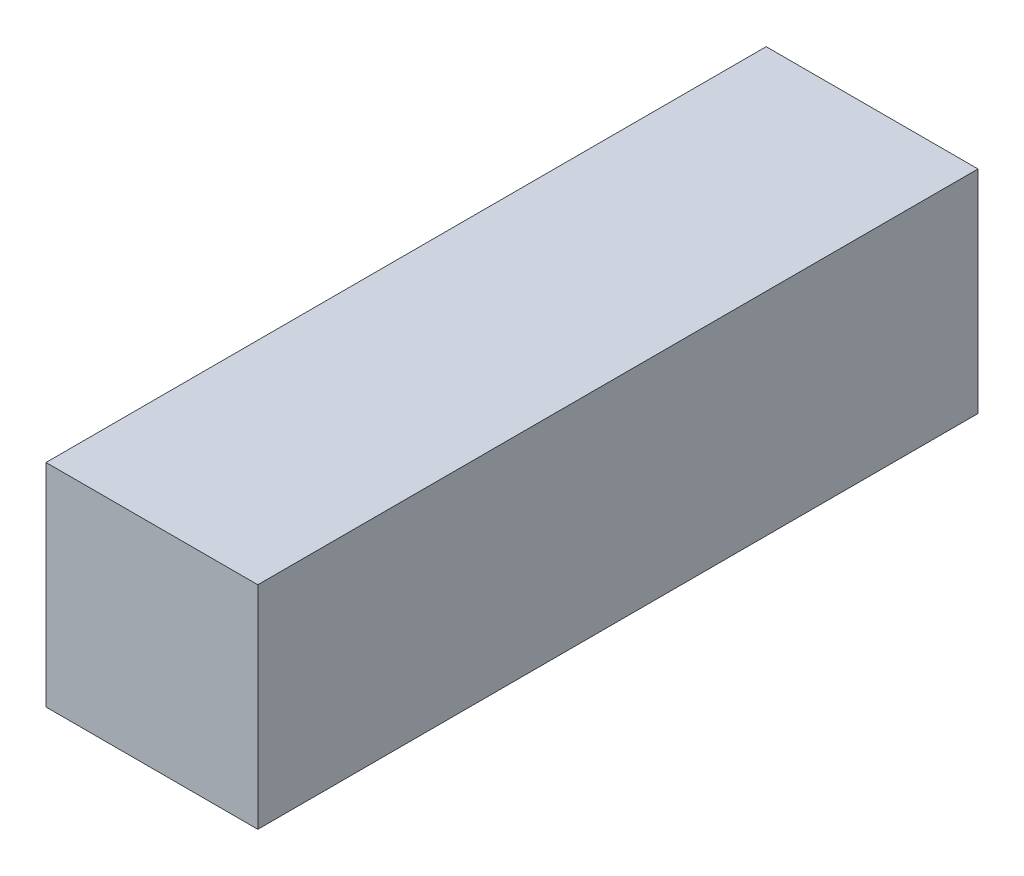
ISO-10303-21;
HEADER;
FILE_DESCRIPTION(('STEP AP214'),'2;1');
FILE_NAME('part.step','',(''),(''),'','','');
FILE_SCHEMA(('AUTOMOTIVE_DESIGN { 1 0 10303 214 1 1 1 1 }'));
ENDSEC;
DATA;
#1=APPLICATION_CONTEXT('core data for automotive mechanical design processes');
#2=APPLICATION_PROTOCOL_DEFINITION('international standard','automotive_design',2000,#1);
#3=PRODUCT_CONTEXT('',#1,'mechanical');
#4=PRODUCT('Part','Part','',(#3));
#5=PRODUCT_RELATED_PRODUCT_CATEGORY('part','',(#4));
#6=PRODUCT_DEFINITION_FORMATION('','',#4);
#7=PRODUCT_DEFINITION_CONTEXT('part definition',#1,'design');
#8=PRODUCT_DEFINITION('design','',#6,#7);
#9=PRODUCT_DEFINITION_SHAPE('','',#8);
#10=(LENGTH_UNIT() NAMED_UNIT(*) SI_UNIT(.MILLI.,.METRE.));
#11=(NAMED_UNIT(*) PLANE_ANGLE_UNIT() SI_UNIT($,.RADIAN.));
#12=(NAMED_UNIT(*) SI_UNIT($,.STERADIAN.) SOLID_ANGLE_UNIT());
#13=UNCERTAINTY_MEASURE_WITH_UNIT(LENGTH_MEASURE(1.E-05),#10,'distance_accuracy_value','');
#14=(GEOMETRIC_REPRESENTATION_CONTEXT(3) GLOBAL_UNCERTAINTY_ASSIGNED_CONTEXT((#13)) GLOBAL_UNIT_ASSIGNED_CONTEXT((#10,
#11,#12)) REPRESENTATION_CONTEXT('',''));
#15=CARTESIAN_POINT('',(0.,0.,0.));
#16=DIRECTION('',(0.,0.,1.));
#17=DIRECTION('',(1.,0.,0.));
#18=AXIS2_PLACEMENT_3D('',#15,#16,#17);
#19=CARTESIAN_POINT('',(0.,0.,0.));
#20=DIRECTION('',(0.,0.,1.));
#21=DIRECTION('',(1.,0.,0.));
#22=AXIS2_PLACEMENT_3D('',#19,#20,#21);
#23=PLANE('',#22);
#24=DIRECTION('',(0.,1.,0.));
#25=VECTOR('',#24,1.);
#26=CARTESIAN_POINT('',(-12.,12.,0.));
#27=LINE('',#26,#25);
#28=CARTESIAN_POINT('',(-12.,12.,0.));
#29=VERTEX_POINT('',#28);
#30=CARTESIAN_POINT('',(-12.,32.,0.));
#31=VERTEX_POINT('',#30);
#32=EDGE_CURVE('E83',#29,#31,#27,.T.);
#33=ORIENTED_EDGE('',*,*,#32,.F.);
#34=DIRECTION('',(1.,0.,0.));
#35=VECTOR('',#34,1.);
#36=CARTESIAN_POINT('',(-12.,12.,0.));
#37=LINE('',#36,#35);
#38=CARTESIAN_POINT('',(-32.,12.,0.));
#39=VERTEX_POINT('',#38);
#40=EDGE_CURVE('E94',#39,#29,#37,.T.);
#41=ORIENTED_EDGE('',*,*,#40,.F.);
#42=DIRECTION('',(0.,-1.,0.));
#43=VECTOR('',#42,1.);
#44=CARTESIAN_POINT('',(-32.,12.,0.));
#45=LINE('',#44,#43);
#46=CARTESIAN_POINT('',(-32.,32.,0.));
#47=VERTEX_POINT('',#46);
#48=EDGE_CURVE('E85',#47,#39,#45,.T.);
#49=ORIENTED_EDGE('',*,*,#48,.F.);
#50=DIRECTION('',(-1.,0.,0.));
#51=VECTOR('',#50,1.);
#52=CARTESIAN_POINT('',(-12.,32.,0.));
#53=LINE('',#52,#51);
#54=EDGE_CURVE('E75',#31,#47,#53,.T.);
#55=ORIENTED_EDGE('',*,*,#54,.F.);
#56=EDGE_LOOP('',(#33,#41,#49,#55));
#57=FACE_BOUND('',#56,.T.);
#58=ADVANCED_FACE('F33',(#57),#23,.F.);
#59=CARTESIAN_POINT('',(-12.,12.,96.2842712474639));
#60=DIRECTION('',(0.,1.,0.));
#61=DIRECTION('',(-1.,0.,0.));
#62=AXIS2_PLACEMENT_3D('',#59,#60,#61);
#63=PLANE('',#62);
#64=DIRECTION('',(0.,0.,-1.));
#65=VECTOR('',#64,1.);
#66=CARTESIAN_POINT('',(-12.,12.,96.2842712474639));
#67=LINE('',#66,#65);
#68=CARTESIAN_POINT('',(-12.,12.,68.000000000002));
#69=VERTEX_POINT('',#68);
#70=EDGE_CURVE('E88',#69,#29,#67,.T.);
#71=ORIENTED_EDGE('',*,*,#70,.F.);
#72=DIRECTION('',(-1.,0.,0.));
#73=VECTOR('',#72,1.);
#74=CARTESIAN_POINT('',(-12.,12.,68.000000000002));
#75=LINE('',#74,#73);
#76=CARTESIAN_POINT('',(-32.,12.,68.000000000002));
#77=VERTEX_POINT('',#76);
#78=EDGE_CURVE('E37',#69,#77,#75,.T.);
#79=ORIENTED_EDGE('',*,*,#78,.T.);
#80=DIRECTION('',(0.,0.,-1.));
#81=VECTOR('',#80,1.);
#82=CARTESIAN_POINT('',(-32.,12.,96.2842712474639));
#83=LINE('',#82,#81);
#84=EDGE_CURVE('E97',#77,#39,#83,.T.);
#85=ORIENTED_EDGE('',*,*,#84,.T.);
#86=ORIENTED_EDGE('',*,*,#40,.T.);
#87=EDGE_LOOP('',(#71,#79,#85,#86));
#88=FACE_BOUND('',#87,.T.);
#89=ADVANCED_FACE('F106',(#88),#63,.F.);
#90=CARTESIAN_POINT('',(-32.,12.,96.2842712474639));
#91=DIRECTION('',(1.,0.,0.));
#92=DIRECTION('',(0.,0.,-1.));
#93=AXIS2_PLACEMENT_3D('',#90,#91,#92);
#94=PLANE('',#93);
#95=ORIENTED_EDGE('',*,*,#84,.F.);
#96=DIRECTION('',(0.,1.,0.));
#97=VECTOR('',#96,1.);
#98=CARTESIAN_POINT('',(-32.,12.,68.000000000002));
#99=LINE('',#98,#97);
#100=CARTESIAN_POINT('',(-32.,32.,68.000000000002));
#101=VERTEX_POINT('',#100);
#102=EDGE_CURVE('E103',#77,#101,#99,.T.);
#103=ORIENTED_EDGE('',*,*,#102,.T.);
#104=DIRECTION('',(0.,0.,-1.));
#105=VECTOR('',#104,1.);
#106=CARTESIAN_POINT('',(-32.,32.,96.2842712474639));
#107=LINE('',#106,#105);
#108=EDGE_CURVE('E79',#101,#47,#107,.T.);
#109=ORIENTED_EDGE('',*,*,#108,.T.);
#110=ORIENTED_EDGE('',*,*,#48,.T.);
#111=EDGE_LOOP('',(#95,#103,#109,#110));
#112=FACE_BOUND('',#111,.T.);
#113=ADVANCED_FACE('F102',(#112),#94,.F.);
#114=CARTESIAN_POINT('',(-12.,32.,96.2842712474639));
#115=DIRECTION('',(0.,-1.,0.));
#116=DIRECTION('',(0.,0.,-1.));
#117=AXIS2_PLACEMENT_3D('',#114,#115,#116);
#118=PLANE('',#117);
#119=ORIENTED_EDGE('',*,*,#108,.F.);
#120=DIRECTION('',(1.,0.,0.));
#121=VECTOR('',#120,1.);
#122=CARTESIAN_POINT('',(-12.,32.,68.000000000002));
#123=LINE('',#122,#121);
#124=CARTESIAN_POINT('',(-12.,32.,68.000000000002));
#125=VERTEX_POINT('',#124);
#126=EDGE_CURVE('E42',#101,#125,#123,.T.);
#127=ORIENTED_EDGE('',*,*,#126,.T.);
#128=DIRECTION('',(0.,0.,-1.));
#129=VECTOR('',#128,1.);
#130=CARTESIAN_POINT('',(-12.,32.,96.2842712474639));
#131=LINE('',#130,#129);
#132=EDGE_CURVE('E72',#125,#31,#131,.T.);
#133=ORIENTED_EDGE('',*,*,#132,.T.);
#134=ORIENTED_EDGE('',*,*,#54,.T.);
#135=EDGE_LOOP('',(#119,#127,#133,#134));
#136=FACE_BOUND('',#135,.T.);
#137=ADVANCED_FACE('F74',(#136),#118,.F.);
#138=CARTESIAN_POINT('',(-12.,12.,96.2842712474639));
#139=DIRECTION('',(-1.,0.,0.));
#140=DIRECTION('',(0.,0.,1.));
#141=AXIS2_PLACEMENT_3D('',#138,#139,#140);
#142=PLANE('',#141);
#143=ORIENTED_EDGE('',*,*,#132,.F.);
#144=DIRECTION('',(0.,-1.,0.));
#145=VECTOR('',#144,1.);
#146=CARTESIAN_POINT('',(-12.,12.,68.000000000002));
#147=LINE('',#146,#145);
#148=EDGE_CURVE('E11',#125,#69,#147,.T.);
#149=ORIENTED_EDGE('',*,*,#148,.T.);
#150=ORIENTED_EDGE('',*,*,#70,.T.);
#151=ORIENTED_EDGE('',*,*,#32,.T.);
#152=EDGE_LOOP('',(#143,#149,#150,#151));
#153=FACE_BOUND('',#152,.T.);
#154=ADVANCED_FACE('F35',(#153),#142,.F.);
#155=CARTESIAN_POINT('',(2.22044604925031E-13,11.9999999999996,68.000000000002));
#156=DIRECTION('',(0.,0.,-1.));
#157=DIRECTION('',(-1.,0.,0.));
#158=AXIS2_PLACEMENT_3D('',#155,#156,#157);
#159=PLANE('',#158);
#160=ORIENTED_EDGE('',*,*,#126,.F.);
#161=ORIENTED_EDGE('',*,*,#102,.F.);
#162=ORIENTED_EDGE('',*,*,#78,.F.);
#163=ORIENTED_EDGE('',*,*,#148,.F.);
#164=EDGE_LOOP('',(#160,#161,#162,#163));
#165=FACE_BOUND('',#164,.T.);
#166=ADVANCED_FACE('F120',(#165),#159,.F.);
#167=CLOSED_SHELL('',(#58,#89,#113,#137,#154,#166));
#168=MANIFOLD_SOLID_BREP('B2',#167);
#169=ADVANCED_BREP_SHAPE_REPRESENTATION('',(#18,#168),#14);
#170=SHAPE_DEFINITION_REPRESENTATION(#9,#169);
ENDSEC;
END-ISO-10303-21;
